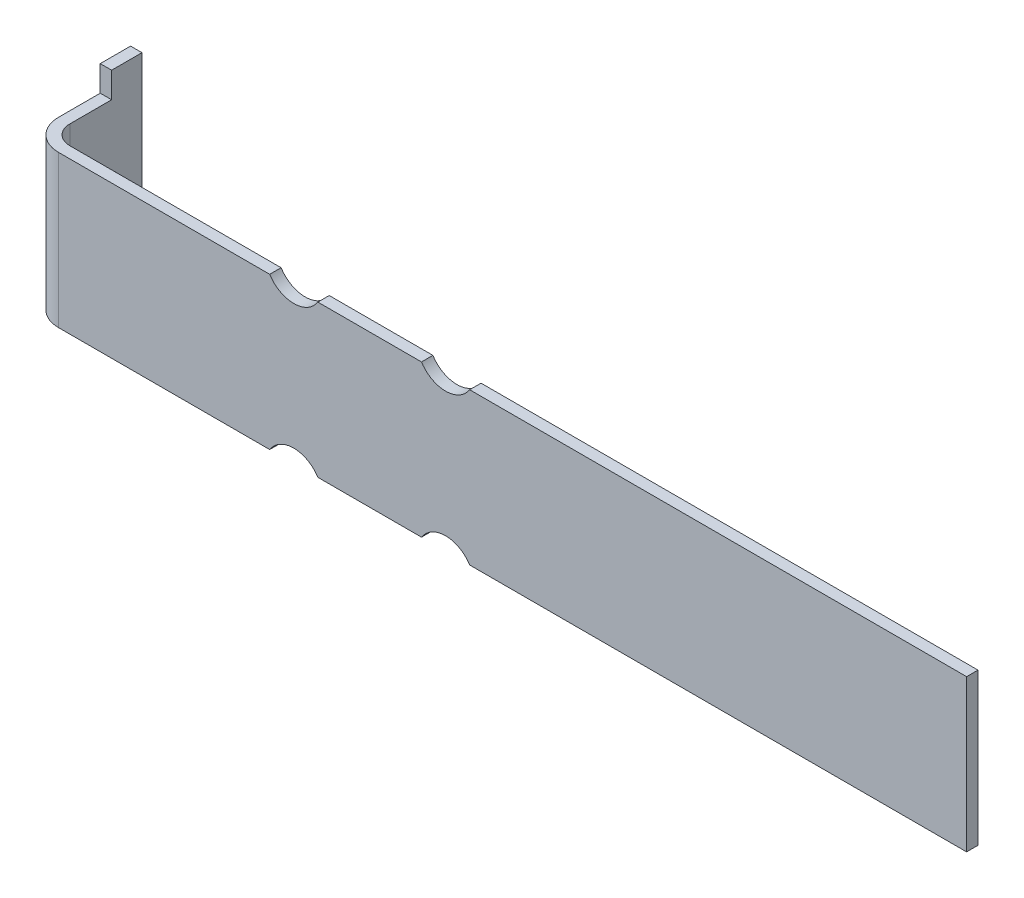
ISO-10303-21;
HEADER;
FILE_DESCRIPTION(('STEP AP214'),'2;1');
FILE_NAME('part.step','',(''),(''),'','','');
FILE_SCHEMA(('AUTOMOTIVE_DESIGN { 1 0 10303 214 1 1 1 1 }'));
ENDSEC;
DATA;
#1=APPLICATION_CONTEXT('core data for automotive mechanical design processes');
#2=APPLICATION_PROTOCOL_DEFINITION('international standard','automotive_design',2000,#1);
#3=PRODUCT_CONTEXT('',#1,'mechanical');
#4=PRODUCT('Part','Part','',(#3));
#5=PRODUCT_RELATED_PRODUCT_CATEGORY('part','',(#4));
#6=PRODUCT_DEFINITION_FORMATION('','',#4);
#7=PRODUCT_DEFINITION_CONTEXT('part definition',#1,'design');
#8=PRODUCT_DEFINITION('design','',#6,#7);
#9=PRODUCT_DEFINITION_SHAPE('','',#8);
#10=(LENGTH_UNIT() NAMED_UNIT(*) SI_UNIT(.MILLI.,.METRE.));
#11=(NAMED_UNIT(*) PLANE_ANGLE_UNIT() SI_UNIT($,.RADIAN.));
#12=(NAMED_UNIT(*) SI_UNIT($,.STERADIAN.) SOLID_ANGLE_UNIT());
#13=UNCERTAINTY_MEASURE_WITH_UNIT(LENGTH_MEASURE(1.E-05),#10,'distance_accuracy_value','');
#14=(GEOMETRIC_REPRESENTATION_CONTEXT(3) GLOBAL_UNCERTAINTY_ASSIGNED_CONTEXT((#13)) GLOBAL_UNIT_ASSIGNED_CONTEXT((#10,
#11,#12)) REPRESENTATION_CONTEXT('',''));
#15=CARTESIAN_POINT('',(0.,0.,0.));
#16=DIRECTION('',(0.,0.,1.));
#17=DIRECTION('',(1.,0.,0.));
#18=AXIS2_PLACEMENT_3D('',#15,#16,#17);
#19=CARTESIAN_POINT('',(-0.15,0.,1.5));
#20=DIRECTION('',(-1.,0.,0.));
#21=DIRECTION('',(0.,0.,1.));
#22=AXIS2_PLACEMENT_3D('',#19,#20,#21);
#23=PLANE('',#22);
#24=DIRECTION('',(0.,0.,1.));
#25=VECTOR('',#24,1.);
#26=CARTESIAN_POINT('',(-0.150000000000001,-2.675,0.));
#27=LINE('',#26,#25);
#28=CARTESIAN_POINT('',(-0.150000000000001,-2.675,-0.4));
#29=VERTEX_POINT('',#28);
#30=CARTESIAN_POINT('',(-0.150000000000001,-2.675,0.4));
#31=VERTEX_POINT('',#30);
#32=EDGE_CURVE('E165',#29,#31,#27,.T.);
#33=ORIENTED_EDGE('',*,*,#32,.T.);
#34=DIRECTION('',(0.,1.,0.));
#35=VECTOR('',#34,1.);
#36=CARTESIAN_POINT('',(-0.15,0.,0.4));
#37=LINE('',#36,#35);
#38=CARTESIAN_POINT('',(-0.15,-2.,0.4));
#39=VERTEX_POINT('',#38);
#40=EDGE_CURVE('E156',#31,#39,#37,.T.);
#41=ORIENTED_EDGE('',*,*,#40,.T.);
#42=DIRECTION('',(0.,0.,1.));
#43=VECTOR('',#42,1.);
#44=CARTESIAN_POINT('',(-0.15,-2.,1.5));
#45=LINE('',#44,#43);
#46=CARTESIAN_POINT('',(-0.149999999999999,-2.,1.5));
#47=VERTEX_POINT('',#46);
#48=EDGE_CURVE('E140',#39,#47,#45,.T.);
#49=ORIENTED_EDGE('',*,*,#48,.T.);
#50=DIRECTION('',(0.,1.,0.));
#51=VECTOR('',#50,1.);
#52=CARTESIAN_POINT('',(-0.149999999999999,0.,1.5));
#53=LINE('',#52,#51);
#54=CARTESIAN_POINT('',(-0.149999999999999,2.,1.5));
#55=VERTEX_POINT('',#54);
#56=EDGE_CURVE('E230',#55,#47,#53,.F.);
#57=ORIENTED_EDGE('',*,*,#56,.F.);
#58=DIRECTION('',(0.,0.,1.));
#59=VECTOR('',#58,1.);
#60=CARTESIAN_POINT('',(-0.15,2.,1.5));
#61=LINE('',#60,#59);
#62=CARTESIAN_POINT('',(-0.15,2.,0.4));
#63=VERTEX_POINT('',#62);
#64=EDGE_CURVE('E151',#55,#63,#61,.F.);
#65=ORIENTED_EDGE('',*,*,#64,.T.);
#66=DIRECTION('',(0.,1.,0.));
#67=VECTOR('',#66,1.);
#68=CARTESIAN_POINT('',(-0.15,0.,0.4));
#69=LINE('',#68,#67);
#70=CARTESIAN_POINT('',(-0.15,2.675,0.4));
#71=VERTEX_POINT('',#70);
#72=EDGE_CURVE('E167',#63,#71,#69,.T.);
#73=ORIENTED_EDGE('',*,*,#72,.T.);
#74=DIRECTION('',(0.,0.,1.));
#75=VECTOR('',#74,1.);
#76=CARTESIAN_POINT('',(-0.150000000000001,2.675,0.));
#77=LINE('',#76,#75);
#78=CARTESIAN_POINT('',(-0.150000000000001,2.675,-0.4));
#79=VERTEX_POINT('',#78);
#80=EDGE_CURVE('E235',#79,#71,#77,.T.);
#81=ORIENTED_EDGE('',*,*,#80,.F.);
#82=DIRECTION('',(0.,1.,0.));
#83=VECTOR('',#82,1.);
#84=CARTESIAN_POINT('',(-0.150000000000001,0.,-0.4));
#85=LINE('',#84,#83);
#86=EDGE_CURVE('E179',#29,#79,#85,.T.);
#87=ORIENTED_EDGE('',*,*,#86,.F.);
#88=EDGE_LOOP('',(#33,#41,#49,#57,#65,#73,#81,#87));
#89=FACE_BOUND('',#88,.T.);
#90=ADVANCED_FACE('F17',(#89),#23,.T.);
#91=CARTESIAN_POINT('',(0.,-2.675,0.));
#92=DIRECTION('',(0.,1.,0.));
#93=DIRECTION('',(0.,0.,1.));
#94=AXIS2_PLACEMENT_3D('',#91,#92,#93);
#95=PLANE('',#94);
#96=DIRECTION('',(0.,0.,-1.));
#97=VECTOR('',#96,1.);
#98=CARTESIAN_POINT('',(0.149999999999999,-2.675,-0.4));
#99=LINE('',#98,#97);
#100=CARTESIAN_POINT('',(0.149999999999999,-2.675,0.4));
#101=VERTEX_POINT('',#100);
#102=CARTESIAN_POINT('',(0.15,-2.675,-0.4));
#103=VERTEX_POINT('',#102);
#104=EDGE_CURVE('E334',#101,#103,#99,.T.);
#105=ORIENTED_EDGE('',*,*,#104,.F.);
#106=DIRECTION('',(1.,0.,0.));
#107=VECTOR('',#106,1.);
#108=CARTESIAN_POINT('',(-0.150000000000001,-2.675,0.4));
#109=LINE('',#108,#107);
#110=EDGE_CURVE('E229',#31,#101,#109,.T.);
#111=ORIENTED_EDGE('',*,*,#110,.F.);
#112=ORIENTED_EDGE('',*,*,#32,.F.);
#113=DIRECTION('',(-1.,0.,0.));
#114=VECTOR('',#113,1.);
#115=CARTESIAN_POINT('',(-0.150000000000001,-2.675,-0.4));
#116=LINE('',#115,#114);
#117=EDGE_CURVE('E169',#103,#29,#116,.T.);
#118=ORIENTED_EDGE('',*,*,#117,.F.);
#119=EDGE_LOOP('',(#105,#111,#112,#118));
#120=FACE_BOUND('',#119,.T.);
#121=ADVANCED_FACE('F359',(#120),#95,.F.);
#122=CARTESIAN_POINT('',(-0.150000000000001,0.,-0.4));
#123=DIRECTION('',(0.,0.,-1.));
#124=DIRECTION('',(-1.,0.,0.));
#125=AXIS2_PLACEMENT_3D('',#122,#123,#124);
#126=PLANE('',#125);
#127=ORIENTED_EDGE('',*,*,#86,.T.);
#128=DIRECTION('',(1.,0.,0.));
#129=VECTOR('',#128,1.);
#130=CARTESIAN_POINT('',(0.,2.675,-0.4));
#131=LINE('',#130,#129);
#132=CARTESIAN_POINT('',(0.149999999999999,2.675,-0.4));
#133=VERTEX_POINT('',#132);
#134=EDGE_CURVE('E182',#133,#79,#131,.F.);
#135=ORIENTED_EDGE('',*,*,#134,.F.);
#136=DIRECTION('',(0.,1.,0.));
#137=VECTOR('',#136,1.);
#138=CARTESIAN_POINT('',(0.149999999999999,0.,-0.4));
#139=LINE('',#138,#137);
#140=EDGE_CURVE('E273',#103,#133,#139,.T.);
#141=ORIENTED_EDGE('',*,*,#140,.F.);
#142=ORIENTED_EDGE('',*,*,#117,.T.);
#143=EDGE_LOOP('',(#127,#135,#141,#142));
#144=FACE_BOUND('',#143,.T.);
#145=ADVANCED_FACE('F360',(#144),#126,.T.);
#146=CARTESIAN_POINT('',(0.,2.675,0.));
#147=DIRECTION('',(0.,1.,0.));
#148=DIRECTION('',(0.,0.,1.));
#149=AXIS2_PLACEMENT_3D('',#146,#147,#148);
#150=PLANE('',#149);
#151=ORIENTED_EDGE('',*,*,#134,.T.);
#152=ORIENTED_EDGE('',*,*,#80,.T.);
#153=DIRECTION('',(1.,0.,0.));
#154=VECTOR('',#153,1.);
#155=CARTESIAN_POINT('',(-0.150000000000001,2.675,0.4));
#156=LINE('',#155,#154);
#157=CARTESIAN_POINT('',(0.15,2.675,0.4));
#158=VERTEX_POINT('',#157);
#159=EDGE_CURVE('E278',#158,#71,#156,.F.);
#160=ORIENTED_EDGE('',*,*,#159,.F.);
#161=DIRECTION('',(0.,0.,-1.));
#162=VECTOR('',#161,1.);
#163=CARTESIAN_POINT('',(0.149999999999999,2.675,-0.4));
#164=LINE('',#163,#162);
#165=EDGE_CURVE('E266',#133,#158,#164,.F.);
#166=ORIENTED_EDGE('',*,*,#165,.F.);
#167=EDGE_LOOP('',(#151,#152,#160,#166));
#168=FACE_BOUND('',#167,.T.);
#169=ADVANCED_FACE('F279',(#168),#150,.T.);
#170=CARTESIAN_POINT('',(0.650000000000001,0.,1.5));
#171=DIRECTION('',(0.,1.,0.));
#172=DIRECTION('',(0.,0.,1.));
#173=AXIS2_PLACEMENT_3D('',#170,#171,#172);
#174=CYLINDRICAL_SURFACE('',#173,0.8);
#175=CARTESIAN_POINT('',(0.650000000000001,-2.,1.5));
#176=DIRECTION('',(0.,1.,0.));
#177=DIRECTION('',(0.,0.,1.));
#178=AXIS2_PLACEMENT_3D('',#175,#176,#177);
#179=CIRCLE('',#178,0.8);
#180=CARTESIAN_POINT('',(0.650000000000001,-2.,2.3));
#181=VERTEX_POINT('',#180);
#182=EDGE_CURVE('E146',#47,#181,#179,.T.);
#183=ORIENTED_EDGE('',*,*,#182,.T.);
#184=DIRECTION('',(0.,1.,0.));
#185=VECTOR('',#184,1.);
#186=CARTESIAN_POINT('',(0.650000000000001,0.,2.3));
#187=LINE('',#186,#185);
#188=CARTESIAN_POINT('',(0.650000000000001,2.,2.3));
#189=VERTEX_POINT('',#188);
#190=EDGE_CURVE('E228',#189,#181,#187,.F.);
#191=ORIENTED_EDGE('',*,*,#190,.F.);
#192=CARTESIAN_POINT('',(0.650000000000001,2.,1.5));
#193=DIRECTION('',(0.,1.,0.));
#194=DIRECTION('',(0.,0.,1.));
#195=AXIS2_PLACEMENT_3D('',#192,#193,#194);
#196=CIRCLE('',#195,0.8);
#197=EDGE_CURVE('E20',#189,#55,#196,.F.);
#198=ORIENTED_EDGE('',*,*,#197,.T.);
#199=ORIENTED_EDGE('',*,*,#56,.T.);
#200=EDGE_LOOP('',(#183,#191,#198,#199));
#201=FACE_BOUND('',#200,.T.);
#202=ADVANCED_FACE('F368',(#201),#174,.T.);
#203=CARTESIAN_POINT('',(-0.150000000000001,0.,0.4));
#204=DIRECTION('',(0.,0.,1.));
#205=DIRECTION('',(1.,0.,0.));
#206=AXIS2_PLACEMENT_3D('',#203,#204,#205);
#207=PLANE('',#206);
#208=ORIENTED_EDGE('',*,*,#110,.T.);
#209=DIRECTION('',(0.,1.,0.));
#210=VECTOR('',#209,1.);
#211=CARTESIAN_POINT('',(0.149999999999999,0.,0.4));
#212=LINE('',#211,#210);
#213=CARTESIAN_POINT('',(0.15,-2.,0.4));
#214=VERTEX_POINT('',#213);
#215=EDGE_CURVE('E159',#214,#101,#212,.F.);
#216=ORIENTED_EDGE('',*,*,#215,.F.);
#217=DIRECTION('',(1.,0.,0.));
#218=VECTOR('',#217,1.);
#219=CARTESIAN_POINT('',(11.2626395661686,-2.,0.4));
#220=LINE('',#219,#218);
#221=EDGE_CURVE('E145',#214,#39,#220,.F.);
#222=ORIENTED_EDGE('',*,*,#221,.T.);
#223=ORIENTED_EDGE('',*,*,#40,.F.);
#224=EDGE_LOOP('',(#208,#216,#222,#223));
#225=FACE_BOUND('',#224,.T.);
#226=ADVANCED_FACE('F155',(#225),#207,.T.);
#227=CARTESIAN_POINT('',(0.149999999999999,0.,-0.4));
#228=DIRECTION('',(1.,0.,0.));
#229=DIRECTION('',(0.,0.,-1.));
#230=AXIS2_PLACEMENT_3D('',#227,#228,#229);
#231=PLANE('',#230);
#232=ORIENTED_EDGE('',*,*,#165,.T.);
#233=DIRECTION('',(0.,1.,0.));
#234=VECTOR('',#233,1.);
#235=CARTESIAN_POINT('',(0.15,0.,0.4));
#236=LINE('',#235,#234);
#237=CARTESIAN_POINT('',(0.149999999999999,2.,0.4));
#238=VERTEX_POINT('',#237);
#239=EDGE_CURVE('E270',#238,#158,#236,.T.);
#240=ORIENTED_EDGE('',*,*,#239,.F.);
#241=DIRECTION('',(0.,0.,-1.));
#242=VECTOR('',#241,1.);
#243=CARTESIAN_POINT('',(0.149999999999999,2.,-0.4));
#244=LINE('',#243,#242);
#245=CARTESIAN_POINT('',(0.15,2.,1.5));
#246=VERTEX_POINT('',#245);
#247=EDGE_CURVE('E118',#238,#246,#244,.F.);
#248=ORIENTED_EDGE('',*,*,#247,.T.);
#249=DIRECTION('',(0.,1.,0.));
#250=VECTOR('',#249,1.);
#251=CARTESIAN_POINT('',(0.150000000000001,0.,1.5));
#252=LINE('',#251,#250);
#253=CARTESIAN_POINT('',(0.150000000000001,-2.,1.5));
#254=VERTEX_POINT('',#253);
#255=EDGE_CURVE('E217',#246,#254,#252,.F.);
#256=ORIENTED_EDGE('',*,*,#255,.T.);
#257=DIRECTION('',(0.,0.,1.));
#258=VECTOR('',#257,1.);
#259=CARTESIAN_POINT('',(0.150000000000001,-2.,2.01554186382778));
#260=LINE('',#259,#258);
#261=EDGE_CURVE('E162',#254,#214,#260,.F.);
#262=ORIENTED_EDGE('',*,*,#261,.T.);
#263=ORIENTED_EDGE('',*,*,#215,.T.);
#264=ORIENTED_EDGE('',*,*,#104,.T.);
#265=ORIENTED_EDGE('',*,*,#140,.T.);
#266=EDGE_LOOP('',(#232,#240,#248,#256,#262,#263,#264,#265));
#267=FACE_BOUND('',#266,.T.);
#268=ADVANCED_FACE('F268',(#267),#231,.T.);
#269=CARTESIAN_POINT('',(-0.150000000000001,0.,0.4));
#270=DIRECTION('',(0.,0.,1.));
#271=DIRECTION('',(1.,0.,0.));
#272=AXIS2_PLACEMENT_3D('',#269,#270,#271);
#273=PLANE('',#272);
#274=ORIENTED_EDGE('',*,*,#159,.T.);
#275=ORIENTED_EDGE('',*,*,#72,.F.);
#276=DIRECTION('',(1.,0.,0.));
#277=VECTOR('',#276,1.);
#278=CARTESIAN_POINT('',(11.2626395661686,2.,0.4));
#279=LINE('',#278,#277);
#280=EDGE_CURVE('E214',#238,#63,#279,.F.);
#281=ORIENTED_EDGE('',*,*,#280,.F.);
#282=ORIENTED_EDGE('',*,*,#239,.T.);
#283=EDGE_LOOP('',(#274,#275,#281,#282));
#284=FACE_BOUND('',#283,.T.);
#285=ADVANCED_FACE('F282',(#284),#273,.T.);
#286=CARTESIAN_POINT('',(24.58,0.,2.3));
#287=DIRECTION('',(0.,0.,1.));
#288=DIRECTION('',(1.,0.,0.));
#289=AXIS2_PLACEMENT_3D('',#286,#287,#288);
#290=PLANE('',#289);
#291=DIRECTION('',(0.,1.,0.));
#292=VECTOR('',#291,1.);
#293=CARTESIAN_POINT('',(24.58,0.,2.3));
#294=LINE('',#293,#292);
#295=CARTESIAN_POINT('',(24.58,2.,2.3));
#296=VERTEX_POINT('',#295);
#297=CARTESIAN_POINT('',(24.58,-2.,2.3));
#298=VERTEX_POINT('',#297);
#299=EDGE_CURVE('E323',#296,#298,#294,.F.);
#300=ORIENTED_EDGE('',*,*,#299,.F.);
#301=DIRECTION('',(1.,0.,0.));
#302=VECTOR('',#301,1.);
#303=CARTESIAN_POINT('',(11.2626395661686,2.,2.3));
#304=LINE('',#303,#302);
#305=CARTESIAN_POINT('',(11.4844288770225,2.,2.3));
#306=VERTEX_POINT('',#305);
#307=EDGE_CURVE('E324',#306,#296,#304,.T.);
#308=ORIENTED_EDGE('',*,*,#307,.F.);
#309=CARTESIAN_POINT('',(10.85,2.4,2.3));
#310=DIRECTION('',(0.,0.,-1.));
#311=DIRECTION('',(-1.,0.,0.));
#312=AXIS2_PLACEMENT_3D('',#309,#310,#311);
#313=CIRCLE('',#312,0.75);
#314=CARTESIAN_POINT('',(10.2155711229775,2.,2.3));
#315=VERTEX_POINT('',#314);
#316=EDGE_CURVE('E226',#306,#315,#313,.T.);
#317=ORIENTED_EDGE('',*,*,#316,.T.);
#318=DIRECTION('',(1.,0.,0.));
#319=VECTOR('',#318,1.);
#320=CARTESIAN_POINT('',(11.2626395661686,2.,2.3));
#321=LINE('',#320,#319);
#322=CARTESIAN_POINT('',(7.48442887702248,2.,2.3));
#323=VERTEX_POINT('',#322);
#324=EDGE_CURVE('E207',#323,#315,#321,.T.);
#325=ORIENTED_EDGE('',*,*,#324,.F.);
#326=CARTESIAN_POINT('',(6.85,2.4,2.3));
#327=DIRECTION('',(0.,0.,-1.));
#328=DIRECTION('',(-1.,0.,0.));
#329=AXIS2_PLACEMENT_3D('',#326,#327,#328);
#330=CIRCLE('',#329,0.75);
#331=CARTESIAN_POINT('',(6.21557112297753,2.,2.3));
#332=VERTEX_POINT('',#331);
#333=EDGE_CURVE('E208',#323,#332,#330,.T.);
#334=ORIENTED_EDGE('',*,*,#333,.T.);
#335=DIRECTION('',(1.,0.,0.));
#336=VECTOR('',#335,1.);
#337=CARTESIAN_POINT('',(11.2626395661686,2.,2.3));
#338=LINE('',#337,#336);
#339=EDGE_CURVE('E211',#189,#332,#338,.T.);
#340=ORIENTED_EDGE('',*,*,#339,.F.);
#341=ORIENTED_EDGE('',*,*,#190,.T.);
#342=DIRECTION('',(1.,0.,0.));
#343=VECTOR('',#342,1.);
#344=CARTESIAN_POINT('',(11.2626395661686,-2.,2.3));
#345=LINE('',#344,#343);
#346=CARTESIAN_POINT('',(6.21557112297753,-2.,2.3));
#347=VERTEX_POINT('',#346);
#348=EDGE_CURVE('E161',#181,#347,#345,.T.);
#349=ORIENTED_EDGE('',*,*,#348,.T.);
#350=CARTESIAN_POINT('',(6.85,-2.4,2.3));
#351=DIRECTION('',(0.,0.,-1.));
#352=DIRECTION('',(-1.,0.,0.));
#353=AXIS2_PLACEMENT_3D('',#350,#351,#352);
#354=CIRCLE('',#353,0.75);
#355=CARTESIAN_POINT('',(7.48442887702248,-2.,2.3));
#356=VERTEX_POINT('',#355);
#357=EDGE_CURVE('E218',#347,#356,#354,.T.);
#358=ORIENTED_EDGE('',*,*,#357,.T.);
#359=DIRECTION('',(1.,0.,0.));
#360=VECTOR('',#359,1.);
#361=CARTESIAN_POINT('',(11.2626395661686,-2.,2.3));
#362=LINE('',#361,#360);
#363=CARTESIAN_POINT('',(10.2155711229775,-2.,2.3));
#364=VERTEX_POINT('',#363);
#365=EDGE_CURVE('E309',#356,#364,#362,.T.);
#366=ORIENTED_EDGE('',*,*,#365,.T.);
#367=CARTESIAN_POINT('',(10.85,-2.4,2.3));
#368=DIRECTION('',(0.,0.,-1.));
#369=DIRECTION('',(-1.,0.,0.));
#370=AXIS2_PLACEMENT_3D('',#367,#368,#369);
#371=CIRCLE('',#370,0.75);
#372=CARTESIAN_POINT('',(11.4844288770225,-2.,2.3));
#373=VERTEX_POINT('',#372);
#374=EDGE_CURVE('E222',#364,#373,#371,.T.);
#375=ORIENTED_EDGE('',*,*,#374,.T.);
#376=DIRECTION('',(1.,0.,0.));
#377=VECTOR('',#376,1.);
#378=CARTESIAN_POINT('',(11.2626395661686,-2.,2.3));
#379=LINE('',#378,#377);
#380=EDGE_CURVE('E312',#373,#298,#379,.T.);
#381=ORIENTED_EDGE('',*,*,#380,.T.);
#382=EDGE_LOOP('',(#300,#308,#317,#325,#334,#340,#341,#349,#358,#366,#375,#381));
#383=FACE_BOUND('',#382,.T.);
#384=ADVANCED_FACE('F419',(#383),#290,.T.);
#385=CARTESIAN_POINT('',(10.85,2.4,2.3));
#386=DIRECTION('',(0.,0.,-1.));
#387=DIRECTION('',(-1.,0.,0.));
#388=AXIS2_PLACEMENT_3D('',#385,#386,#387);
#389=CYLINDRICAL_SURFACE('',#388,0.75);
#390=CARTESIAN_POINT('',(10.85,2.4,2.));
#391=DIRECTION('',(0.,0.,-1.));
#392=DIRECTION('',(-1.,0.,0.));
#393=AXIS2_PLACEMENT_3D('',#390,#391,#392);
#394=CIRCLE('',#393,0.75);
#395=CARTESIAN_POINT('',(10.2155711229775,2.,2.));
#396=VERTEX_POINT('',#395);
#397=CARTESIAN_POINT('',(11.4844288770225,2.,2.));
#398=VERTEX_POINT('',#397);
#399=EDGE_CURVE('E203',#396,#398,#394,.F.);
#400=ORIENTED_EDGE('',*,*,#399,.F.);
#401=DIRECTION('',(0.,0.,1.));
#402=VECTOR('',#401,1.);
#403=CARTESIAN_POINT('',(10.2155711229775,2.,2.01554186382778));
#404=LINE('',#403,#402);
#405=EDGE_CURVE('E576',#315,#396,#404,.F.);
#406=ORIENTED_EDGE('',*,*,#405,.F.);
#407=ORIENTED_EDGE('',*,*,#316,.F.);
#408=DIRECTION('',(0.,0.,1.));
#409=VECTOR('',#408,1.);
#410=CARTESIAN_POINT('',(11.4844288770225,2.,2.01554186382778));
#411=LINE('',#410,#409);
#412=EDGE_CURVE('E227',#398,#306,#411,.T.);
#413=ORIENTED_EDGE('',*,*,#412,.F.);
#414=EDGE_LOOP('',(#400,#406,#407,#413));
#415=FACE_BOUND('',#414,.T.);
#416=ADVANCED_FACE('F415',(#415),#389,.F.);
#417=CARTESIAN_POINT('',(11.2626395661686,2.,2.01554186382778));
#418=DIRECTION('',(0.,1.,0.));
#419=DIRECTION('',(0.,0.,1.));
#420=AXIS2_PLACEMENT_3D('',#417,#418,#419);
#421=PLANE('',#420);
#422=DIRECTION('',(0.,0.,-1.));
#423=VECTOR('',#422,1.);
#424=CARTESIAN_POINT('',(24.58,2.,2.));
#425=LINE('',#424,#423);
#426=CARTESIAN_POINT('',(24.58,2.,2.));
#427=VERTEX_POINT('',#426);
#428=EDGE_CURVE('E320',#427,#296,#425,.F.);
#429=ORIENTED_EDGE('',*,*,#428,.F.);
#430=DIRECTION('',(-1.,0.,0.));
#431=VECTOR('',#430,1.);
#432=CARTESIAN_POINT('',(0.65,2.,2.));
#433=LINE('',#432,#431);
#434=EDGE_CURVE('E206',#398,#427,#433,.F.);
#435=ORIENTED_EDGE('',*,*,#434,.F.);
#436=ORIENTED_EDGE('',*,*,#412,.T.);
#437=ORIENTED_EDGE('',*,*,#307,.T.);
#438=EDGE_LOOP('',(#429,#435,#436,#437));
#439=FACE_BOUND('',#438,.T.);
#440=ADVANCED_FACE('F411',(#439),#421,.T.);
#441=CARTESIAN_POINT('',(24.58,0.,2.));
#442=DIRECTION('',(1.,0.,0.));
#443=DIRECTION('',(0.,0.,-1.));
#444=AXIS2_PLACEMENT_3D('',#441,#442,#443);
#445=PLANE('',#444);
#446=DIRECTION('',(0.,0.,1.));
#447=VECTOR('',#446,1.);
#448=CARTESIAN_POINT('',(24.58,-2.,2.01554186382778));
#449=LINE('',#448,#447);
#450=CARTESIAN_POINT('',(24.58,-2.,2.));
#451=VERTEX_POINT('',#450);
#452=EDGE_CURVE('E225',#298,#451,#449,.F.);
#453=ORIENTED_EDGE('',*,*,#452,.T.);
#454=DIRECTION('',(0.,1.,0.));
#455=VECTOR('',#454,1.);
#456=CARTESIAN_POINT('',(24.58,0.,2.));
#457=LINE('',#456,#455);
#458=EDGE_CURVE('E315',#427,#451,#457,.F.);
#459=ORIENTED_EDGE('',*,*,#458,.F.);
#460=ORIENTED_EDGE('',*,*,#428,.T.);
#461=ORIENTED_EDGE('',*,*,#299,.T.);
#462=EDGE_LOOP('',(#453,#459,#460,#461));
#463=FACE_BOUND('',#462,.T.);
#464=ADVANCED_FACE('F407',(#463),#445,.T.);
#465=CARTESIAN_POINT('',(11.2626395661686,-2.,2.01554186382778));
#466=DIRECTION('',(0.,1.,0.));
#467=DIRECTION('',(0.,0.,1.));
#468=AXIS2_PLACEMENT_3D('',#465,#466,#467);
#469=PLANE('',#468);
#470=DIRECTION('',(-1.,0.,0.));
#471=VECTOR('',#470,1.);
#472=CARTESIAN_POINT('',(0.65,-2.,2.));
#473=LINE('',#472,#471);
#474=CARTESIAN_POINT('',(11.4844288770225,-2.,2.));
#475=VERTEX_POINT('',#474);
#476=EDGE_CURVE('E202',#451,#475,#473,.T.);
#477=ORIENTED_EDGE('',*,*,#476,.F.);
#478=ORIENTED_EDGE('',*,*,#452,.F.);
#479=ORIENTED_EDGE('',*,*,#380,.F.);
#480=DIRECTION('',(0.,0.,-1.));
#481=VECTOR('',#480,1.);
#482=CARTESIAN_POINT('',(11.4844288770225,-2.,2.3));
#483=LINE('',#482,#481);
#484=EDGE_CURVE('E224',#373,#475,#483,.T.);
#485=ORIENTED_EDGE('',*,*,#484,.T.);
#486=EDGE_LOOP('',(#477,#478,#479,#485));
#487=FACE_BOUND('',#486,.T.);
#488=ADVANCED_FACE('F403',(#487),#469,.F.);
#489=CARTESIAN_POINT('',(10.85,-2.4,2.3));
#490=DIRECTION('',(0.,0.,-1.));
#491=DIRECTION('',(-1.,0.,0.));
#492=AXIS2_PLACEMENT_3D('',#489,#490,#491);
#493=CYLINDRICAL_SURFACE('',#492,0.75);
#494=ORIENTED_EDGE('',*,*,#374,.F.);
#495=DIRECTION('',(0.,0.,1.));
#496=VECTOR('',#495,1.);
#497=CARTESIAN_POINT('',(10.2155711229775,-2.,2.01554186382778));
#498=LINE('',#497,#496);
#499=CARTESIAN_POINT('',(10.2155711229775,-2.,2.));
#500=VERTEX_POINT('',#499);
#501=EDGE_CURVE('E221',#364,#500,#498,.F.);
#502=ORIENTED_EDGE('',*,*,#501,.T.);
#503=CARTESIAN_POINT('',(10.85,-2.4,2.));
#504=DIRECTION('',(0.,0.,-1.));
#505=DIRECTION('',(-1.,0.,0.));
#506=AXIS2_PLACEMENT_3D('',#503,#504,#505);
#507=CIRCLE('',#506,0.75);
#508=EDGE_CURVE('E199',#475,#500,#507,.F.);
#509=ORIENTED_EDGE('',*,*,#508,.F.);
#510=ORIENTED_EDGE('',*,*,#484,.F.);
#511=EDGE_LOOP('',(#494,#502,#509,#510));
#512=FACE_BOUND('',#511,.T.);
#513=ADVANCED_FACE('F399',(#512),#493,.F.);
#514=CARTESIAN_POINT('',(11.2626395661686,-2.,2.01554186382778));
#515=DIRECTION('',(0.,1.,0.));
#516=DIRECTION('',(0.,0.,1.));
#517=AXIS2_PLACEMENT_3D('',#514,#515,#516);
#518=PLANE('',#517);
#519=DIRECTION('',(-1.,0.,0.));
#520=VECTOR('',#519,1.);
#521=CARTESIAN_POINT('',(0.65,-2.,2.));
#522=LINE('',#521,#520);
#523=CARTESIAN_POINT('',(7.48442887702248,-2.,2.));
#524=VERTEX_POINT('',#523);
#525=EDGE_CURVE('E198',#500,#524,#522,.T.);
#526=ORIENTED_EDGE('',*,*,#525,.F.);
#527=ORIENTED_EDGE('',*,*,#501,.F.);
#528=ORIENTED_EDGE('',*,*,#365,.F.);
#529=DIRECTION('',(0.,0.,-1.));
#530=VECTOR('',#529,1.);
#531=CARTESIAN_POINT('',(7.48442887702248,-2.,2.3));
#532=LINE('',#531,#530);
#533=EDGE_CURVE('E220',#356,#524,#532,.T.);
#534=ORIENTED_EDGE('',*,*,#533,.T.);
#535=EDGE_LOOP('',(#526,#527,#528,#534));
#536=FACE_BOUND('',#535,.T.);
#537=ADVANCED_FACE('F395',(#536),#518,.F.);
#538=CARTESIAN_POINT('',(6.85,-2.4,2.3));
#539=DIRECTION('',(0.,0.,-1.));
#540=DIRECTION('',(-1.,0.,0.));
#541=AXIS2_PLACEMENT_3D('',#538,#539,#540);
#542=CYLINDRICAL_SURFACE('',#541,0.75);
#543=ORIENTED_EDGE('',*,*,#357,.F.);
#544=DIRECTION('',(0.,0.,1.));
#545=VECTOR('',#544,1.);
#546=CARTESIAN_POINT('',(6.21557112297753,-2.,2.01554186382778));
#547=LINE('',#546,#545);
#548=CARTESIAN_POINT('',(6.21557112297753,-2.,2.));
#549=VERTEX_POINT('',#548);
#550=EDGE_CURVE('E302',#347,#549,#547,.F.);
#551=ORIENTED_EDGE('',*,*,#550,.T.);
#552=CARTESIAN_POINT('',(6.85,-2.4,2.));
#553=DIRECTION('',(0.,0.,-1.));
#554=DIRECTION('',(-1.,0.,0.));
#555=AXIS2_PLACEMENT_3D('',#552,#553,#554);
#556=CIRCLE('',#555,0.75);
#557=EDGE_CURVE('E194',#524,#549,#556,.F.);
#558=ORIENTED_EDGE('',*,*,#557,.F.);
#559=ORIENTED_EDGE('',*,*,#533,.F.);
#560=EDGE_LOOP('',(#543,#551,#558,#559));
#561=FACE_BOUND('',#560,.T.);
#562=ADVANCED_FACE('F392',(#561),#542,.F.);
#563=CARTESIAN_POINT('',(11.2626395661686,-2.,2.01554186382778));
#564=DIRECTION('',(0.,1.,0.));
#565=DIRECTION('',(0.,0.,1.));
#566=AXIS2_PLACEMENT_3D('',#563,#564,#565);
#567=PLANE('',#566);
#568=ORIENTED_EDGE('',*,*,#348,.F.);
#569=ORIENTED_EDGE('',*,*,#182,.F.);
#570=ORIENTED_EDGE('',*,*,#48,.F.);
#571=ORIENTED_EDGE('',*,*,#221,.F.);
#572=ORIENTED_EDGE('',*,*,#261,.F.);
#573=CARTESIAN_POINT('',(0.65,-2.,1.5));
#574=DIRECTION('',(0.,1.,0.));
#575=DIRECTION('',(0.,0.,1.));
#576=AXIS2_PLACEMENT_3D('',#573,#574,#575);
#577=CIRCLE('',#576,0.499999999999999);
#578=CARTESIAN_POINT('',(0.65,-2.,2.));
#579=VERTEX_POINT('',#578);
#580=EDGE_CURVE('E215',#254,#579,#577,.T.);
#581=ORIENTED_EDGE('',*,*,#580,.T.);
#582=DIRECTION('',(-1.,0.,0.));
#583=VECTOR('',#582,1.);
#584=CARTESIAN_POINT('',(0.65,-2.,2.));
#585=LINE('',#584,#583);
#586=EDGE_CURVE('E197',#549,#579,#585,.T.);
#587=ORIENTED_EDGE('',*,*,#586,.F.);
#588=ORIENTED_EDGE('',*,*,#550,.F.);
#589=EDGE_LOOP('',(#568,#569,#570,#571,#572,#581,#587,#588));
#590=FACE_BOUND('',#589,.T.);
#591=ADVANCED_FACE('F143',(#590),#567,.F.);
#592=CARTESIAN_POINT('',(0.65,0.,1.5));
#593=DIRECTION('',(0.,1.,0.));
#594=DIRECTION('',(0.,0.,1.));
#595=AXIS2_PLACEMENT_3D('',#592,#593,#594);
#596=CYLINDRICAL_SURFACE('',#595,0.499999999999999);
#597=DIRECTION('',(0.,1.,0.));
#598=VECTOR('',#597,1.);
#599=CARTESIAN_POINT('',(0.65,0.,2.));
#600=LINE('',#599,#598);
#601=CARTESIAN_POINT('',(0.65,2.,2.));
#602=VERTEX_POINT('',#601);
#603=EDGE_CURVE('E298',#579,#602,#600,.T.);
#604=ORIENTED_EDGE('',*,*,#603,.F.);
#605=ORIENTED_EDGE('',*,*,#580,.F.);
#606=ORIENTED_EDGE('',*,*,#255,.F.);
#607=CARTESIAN_POINT('',(0.65,2.,1.5));
#608=DIRECTION('',(0.,1.,0.));
#609=DIRECTION('',(0.,0.,1.));
#610=AXIS2_PLACEMENT_3D('',#607,#608,#609);
#611=CIRCLE('',#610,0.499999999999999);
#612=EDGE_CURVE('E212',#602,#246,#611,.F.);
#613=ORIENTED_EDGE('',*,*,#612,.F.);
#614=EDGE_LOOP('',(#604,#605,#606,#613));
#615=FACE_BOUND('',#614,.T.);
#616=ADVANCED_FACE('F386',(#615),#596,.F.);
#617=CARTESIAN_POINT('',(11.2626395661686,2.,2.01554186382778));
#618=DIRECTION('',(0.,1.,0.));
#619=DIRECTION('',(0.,0.,1.));
#620=AXIS2_PLACEMENT_3D('',#617,#618,#619);
#621=PLANE('',#620);
#622=ORIENTED_EDGE('',*,*,#197,.F.);
#623=ORIENTED_EDGE('',*,*,#339,.T.);
#624=DIRECTION('',(0.,0.,-1.));
#625=VECTOR('',#624,1.);
#626=CARTESIAN_POINT('',(6.21557112297753,2.,2.3));
#627=LINE('',#626,#625);
#628=CARTESIAN_POINT('',(6.21557112297753,2.,2.));
#629=VERTEX_POINT('',#628);
#630=EDGE_CURVE('E210',#332,#629,#627,.T.);
#631=ORIENTED_EDGE('',*,*,#630,.T.);
#632=DIRECTION('',(-1.,0.,0.));
#633=VECTOR('',#632,1.);
#634=CARTESIAN_POINT('',(0.65,2.,2.));
#635=LINE('',#634,#633);
#636=EDGE_CURVE('E193',#602,#629,#635,.F.);
#637=ORIENTED_EDGE('',*,*,#636,.F.);
#638=ORIENTED_EDGE('',*,*,#612,.T.);
#639=ORIENTED_EDGE('',*,*,#247,.F.);
#640=ORIENTED_EDGE('',*,*,#280,.T.);
#641=ORIENTED_EDGE('',*,*,#64,.F.);
#642=EDGE_LOOP('',(#622,#623,#631,#637,#638,#639,#640,#641));
#643=FACE_BOUND('',#642,.T.);
#644=ADVANCED_FACE('F243',(#643),#621,.T.);
#645=CARTESIAN_POINT('',(6.85,2.4,2.3));
#646=DIRECTION('',(0.,0.,-1.));
#647=DIRECTION('',(-1.,0.,0.));
#648=AXIS2_PLACEMENT_3D('',#645,#646,#647);
#649=CYLINDRICAL_SURFACE('',#648,0.75);
#650=CARTESIAN_POINT('',(6.85,2.4,2.));
#651=DIRECTION('',(0.,0.,-1.));
#652=DIRECTION('',(-1.,0.,0.));
#653=AXIS2_PLACEMENT_3D('',#650,#651,#652);
#654=CIRCLE('',#653,0.75);
#655=CARTESIAN_POINT('',(7.48442887702248,2.,2.));
#656=VERTEX_POINT('',#655);
#657=EDGE_CURVE('E26',#629,#656,#654,.F.);
#658=ORIENTED_EDGE('',*,*,#657,.F.);
#659=ORIENTED_EDGE('',*,*,#630,.F.);
#660=ORIENTED_EDGE('',*,*,#333,.F.);
#661=DIRECTION('',(0.,0.,1.));
#662=VECTOR('',#661,1.);
#663=CARTESIAN_POINT('',(7.48442887702248,2.,2.01554186382778));
#664=LINE('',#663,#662);
#665=EDGE_CURVE('E35',#656,#323,#664,.T.);
#666=ORIENTED_EDGE('',*,*,#665,.F.);
#667=EDGE_LOOP('',(#658,#659,#660,#666));
#668=FACE_BOUND('',#667,.T.);
#669=ADVANCED_FACE('F378',(#668),#649,.F.);
#670=CARTESIAN_POINT('',(11.2626395661686,2.,2.01554186382778));
#671=DIRECTION('',(0.,1.,0.));
#672=DIRECTION('',(0.,0.,1.));
#673=AXIS2_PLACEMENT_3D('',#670,#671,#672);
#674=PLANE('',#673);
#675=ORIENTED_EDGE('',*,*,#665,.T.);
#676=ORIENTED_EDGE('',*,*,#324,.T.);
#677=ORIENTED_EDGE('',*,*,#405,.T.);
#678=DIRECTION('',(-1.,0.,0.));
#679=VECTOR('',#678,1.);
#680=CARTESIAN_POINT('',(0.65,2.,2.));
#681=LINE('',#680,#679);
#682=EDGE_CURVE('E11',#656,#396,#681,.F.);
#683=ORIENTED_EDGE('',*,*,#682,.F.);
#684=EDGE_LOOP('',(#675,#676,#677,#683));
#685=FACE_BOUND('',#684,.T.);
#686=ADVANCED_FACE('F372',(#685),#674,.T.);
#687=CARTESIAN_POINT('',(0.65,0.,2.));
#688=DIRECTION('',(0.,0.,-1.));
#689=DIRECTION('',(-1.,0.,0.));
#690=AXIS2_PLACEMENT_3D('',#687,#688,#689);
#691=PLANE('',#690);
#692=ORIENTED_EDGE('',*,*,#657,.T.);
#693=ORIENTED_EDGE('',*,*,#682,.T.);
#694=ORIENTED_EDGE('',*,*,#399,.T.);
#695=ORIENTED_EDGE('',*,*,#434,.T.);
#696=ORIENTED_EDGE('',*,*,#458,.T.);
#697=ORIENTED_EDGE('',*,*,#476,.T.);
#698=ORIENTED_EDGE('',*,*,#508,.T.);
#699=ORIENTED_EDGE('',*,*,#525,.T.);
#700=ORIENTED_EDGE('',*,*,#557,.T.);
#701=ORIENTED_EDGE('',*,*,#586,.T.);
#702=ORIENTED_EDGE('',*,*,#603,.T.);
#703=ORIENTED_EDGE('',*,*,#636,.T.);
#704=EDGE_LOOP('',(#692,#693,#694,#695,#696,#697,#698,#699,#700,#701,#702,#703));
#705=FACE_BOUND('',#704,.T.);
#706=ADVANCED_FACE('F370',(#705),#691,.T.);
#707=CLOSED_SHELL('',(#90,#121,#145,#169,#202,#226,#268,#285,#384,#416,#440,#464,#488,#513,#537,
#562,#591,#616,#644,#669,#686,#706));
#708=MANIFOLD_SOLID_BREP('B1',#707);
#709=ADVANCED_BREP_SHAPE_REPRESENTATION('',(#18,#708),#14);
#710=SHAPE_DEFINITION_REPRESENTATION(#9,#709);
ENDSEC;
END-ISO-10303-21;
